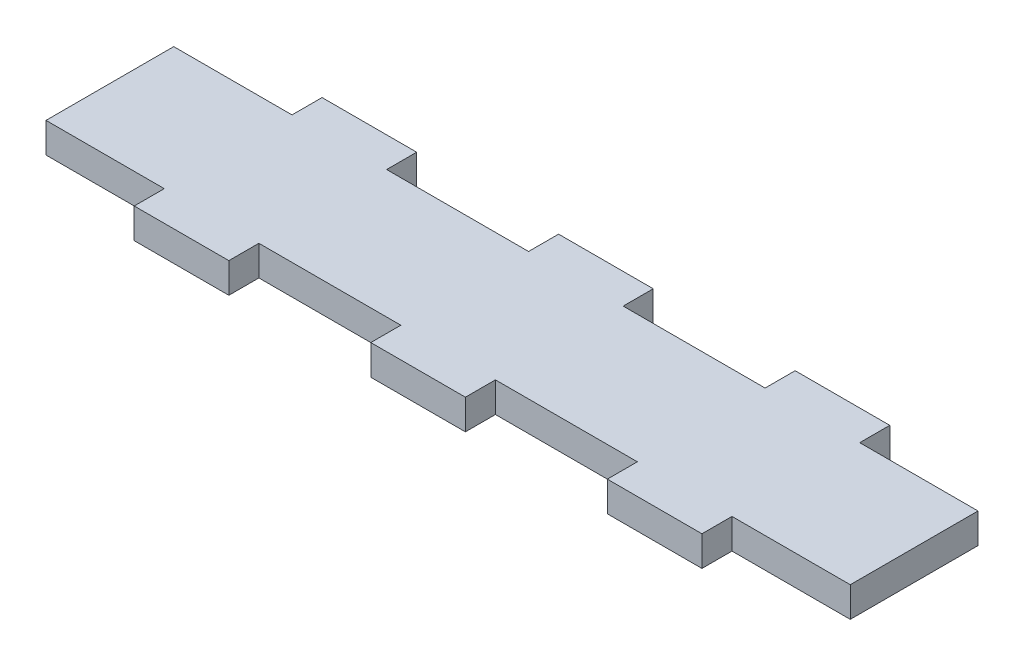
ISO-10303-21;
HEADER;
FILE_DESCRIPTION(('STEP AP214'),'2;1');
FILE_NAME('part.step','',(''),(''),'','','');
FILE_SCHEMA(('AUTOMOTIVE_DESIGN { 1 0 10303 214 1 1 1 1 }'));
ENDSEC;
DATA;
#1=APPLICATION_CONTEXT('core data for automotive mechanical design processes');
#2=APPLICATION_PROTOCOL_DEFINITION('international standard','automotive_design',2000,#1);
#3=PRODUCT_CONTEXT('',#1,'mechanical');
#4=PRODUCT('Part','Part','',(#3));
#5=PRODUCT_RELATED_PRODUCT_CATEGORY('part','',(#4));
#6=PRODUCT_DEFINITION_FORMATION('','',#4);
#7=PRODUCT_DEFINITION_CONTEXT('part definition',#1,'design');
#8=PRODUCT_DEFINITION('design','',#6,#7);
#9=PRODUCT_DEFINITION_SHAPE('','',#8);
#10=(LENGTH_UNIT() NAMED_UNIT(*) SI_UNIT(.MILLI.,.METRE.));
#11=(NAMED_UNIT(*) PLANE_ANGLE_UNIT() SI_UNIT($,.RADIAN.));
#12=(NAMED_UNIT(*) SI_UNIT($,.STERADIAN.) SOLID_ANGLE_UNIT());
#13=UNCERTAINTY_MEASURE_WITH_UNIT(LENGTH_MEASURE(1.E-05),#10,'distance_accuracy_value','');
#14=(GEOMETRIC_REPRESENTATION_CONTEXT(3) GLOBAL_UNCERTAINTY_ASSIGNED_CONTEXT((#13)) GLOBAL_UNIT_ASSIGNED_CONTEXT((#10,
#11,#12)) REPRESENTATION_CONTEXT('',''));
#15=CARTESIAN_POINT('',(0.,0.,0.));
#16=DIRECTION('',(0.,0.,1.));
#17=DIRECTION('',(1.,0.,0.));
#18=AXIS2_PLACEMENT_3D('',#15,#16,#17);
#19=CARTESIAN_POINT('',(60.,6.35,13.5));
#20=DIRECTION('',(0.,0.,-1.));
#21=DIRECTION('',(-1.,0.,0.));
#22=AXIS2_PLACEMENT_3D('',#19,#20,#21);
#23=PLANE('',#22);
#24=DIRECTION('',(1.,0.,0.));
#25=VECTOR('',#24,1.);
#26=CARTESIAN_POINT('',(60.,0.,13.5));
#27=LINE('',#26,#25);
#28=CARTESIAN_POINT('',(60.,0.,13.5));
#29=VERTEX_POINT('',#28);
#30=CARTESIAN_POINT('',(85.,0.,13.5));
#31=VERTEX_POINT('',#30);
#32=EDGE_CURVE('E249',#29,#31,#27,.T.);
#33=ORIENTED_EDGE('',*,*,#32,.T.);
#34=DIRECTION('',(0.,-1.,0.));
#35=VECTOR('',#34,1.);
#36=CARTESIAN_POINT('',(85.,6.35,13.5));
#37=LINE('',#36,#35);
#38=CARTESIAN_POINT('',(85.,6.35,13.5));
#39=VERTEX_POINT('',#38);
#40=EDGE_CURVE('E11',#39,#31,#37,.T.);
#41=ORIENTED_EDGE('',*,*,#40,.F.);
#42=DIRECTION('',(1.,0.,0.));
#43=VECTOR('',#42,1.);
#44=CARTESIAN_POINT('',(60.,6.35,13.5));
#45=LINE('',#44,#43);
#46=CARTESIAN_POINT('',(60.,6.35,13.5));
#47=VERTEX_POINT('',#46);
#48=EDGE_CURVE('E303',#47,#39,#45,.T.);
#49=ORIENTED_EDGE('',*,*,#48,.F.);
#50=DIRECTION('',(0.,-1.,0.));
#51=VECTOR('',#50,1.);
#52=CARTESIAN_POINT('',(60.,6.35,13.5));
#53=LINE('',#52,#51);
#54=EDGE_CURVE('E245',#47,#29,#53,.T.);
#55=ORIENTED_EDGE('',*,*,#54,.T.);
#56=EDGE_LOOP('',(#33,#41,#49,#55));
#57=FACE_BOUND('',#56,.T.);
#58=ADVANCED_FACE('F33',(#57),#23,.F.);
#59=CARTESIAN_POINT('',(85.,6.35,-13.5));
#60=DIRECTION('',(-1.,0.,0.));
#61=DIRECTION('',(0.,0.,1.));
#62=AXIS2_PLACEMENT_3D('',#59,#60,#61);
#63=PLANE('',#62);
#64=DIRECTION('',(0.,0.,-1.));
#65=VECTOR('',#64,1.);
#66=CARTESIAN_POINT('',(85.,0.,-13.5));
#67=LINE('',#66,#65);
#68=CARTESIAN_POINT('',(85.,0.,-13.5));
#69=VERTEX_POINT('',#68);
#70=EDGE_CURVE('E252',#31,#69,#67,.T.);
#71=ORIENTED_EDGE('',*,*,#70,.T.);
#72=DIRECTION('',(0.,-1.,0.));
#73=VECTOR('',#72,1.);
#74=CARTESIAN_POINT('',(85.,6.35,-13.5));
#75=LINE('',#74,#73);
#76=CARTESIAN_POINT('',(85.,6.35,-13.5));
#77=VERTEX_POINT('',#76);
#78=EDGE_CURVE('E41',#77,#69,#75,.T.);
#79=ORIENTED_EDGE('',*,*,#78,.F.);
#80=DIRECTION('',(0.,0.,-1.));
#81=VECTOR('',#80,1.);
#82=CARTESIAN_POINT('',(85.,6.35,-13.5));
#83=LINE('',#82,#81);
#84=EDGE_CURVE('E152',#39,#77,#83,.T.);
#85=ORIENTED_EDGE('',*,*,#84,.F.);
#86=ORIENTED_EDGE('',*,*,#40,.T.);
#87=EDGE_LOOP('',(#71,#79,#85,#86));
#88=FACE_BOUND('',#87,.T.);
#89=ADVANCED_FACE('F461',(#88),#63,.F.);
#90=CARTESIAN_POINT('',(60.,6.35,-13.5));
#91=DIRECTION('',(0.,0.,1.));
#92=DIRECTION('',(1.,0.,0.));
#93=AXIS2_PLACEMENT_3D('',#90,#91,#92);
#94=PLANE('',#93);
#95=DIRECTION('',(-1.,0.,0.));
#96=VECTOR('',#95,1.);
#97=CARTESIAN_POINT('',(60.,0.,-13.5));
#98=LINE('',#97,#96);
#99=CARTESIAN_POINT('',(60.,0.,-13.5));
#100=VERTEX_POINT('',#99);
#101=EDGE_CURVE('E254',#69,#100,#98,.T.);
#102=ORIENTED_EDGE('',*,*,#101,.T.);
#103=DIRECTION('',(0.,-1.,0.));
#104=VECTOR('',#103,1.);
#105=CARTESIAN_POINT('',(60.,6.35,-13.5));
#106=LINE('',#105,#104);
#107=CARTESIAN_POINT('',(60.,6.35,-13.5));
#108=VERTEX_POINT('',#107);
#109=EDGE_CURVE('E370',#108,#100,#106,.T.);
#110=ORIENTED_EDGE('',*,*,#109,.F.);
#111=DIRECTION('',(-1.,0.,0.));
#112=VECTOR('',#111,1.);
#113=CARTESIAN_POINT('',(60.,6.35,-13.5));
#114=LINE('',#113,#112);
#115=EDGE_CURVE('E378',#77,#108,#114,.T.);
#116=ORIENTED_EDGE('',*,*,#115,.F.);
#117=ORIENTED_EDGE('',*,*,#78,.T.);
#118=EDGE_LOOP('',(#102,#110,#116,#117));
#119=FACE_BOUND('',#118,.T.);
#120=ADVANCED_FACE('F376',(#119),#94,.F.);
#121=CARTESIAN_POINT('',(60.,6.35,-19.85));
#122=DIRECTION('',(-1.,0.,0.));
#123=DIRECTION('',(0.,0.,1.));
#124=AXIS2_PLACEMENT_3D('',#121,#122,#123);
#125=PLANE('',#124);
#126=DIRECTION('',(0.,0.,-1.));
#127=VECTOR('',#126,1.);
#128=CARTESIAN_POINT('',(60.,0.,-19.85));
#129=LINE('',#128,#127);
#130=CARTESIAN_POINT('',(60.,0.,-19.85));
#131=VERTEX_POINT('',#130);
#132=EDGE_CURVE('E256',#100,#131,#129,.T.);
#133=ORIENTED_EDGE('',*,*,#132,.T.);
#134=DIRECTION('',(0.,-1.,0.));
#135=VECTOR('',#134,1.);
#136=CARTESIAN_POINT('',(60.,6.35,-19.85));
#137=LINE('',#136,#135);
#138=CARTESIAN_POINT('',(60.,6.35,-19.85));
#139=VERTEX_POINT('',#138);
#140=EDGE_CURVE('E367',#139,#131,#137,.T.);
#141=ORIENTED_EDGE('',*,*,#140,.F.);
#142=DIRECTION('',(0.,0.,-1.));
#143=VECTOR('',#142,1.);
#144=CARTESIAN_POINT('',(60.,6.35,-19.85));
#145=LINE('',#144,#143);
#146=EDGE_CURVE('E396',#108,#139,#145,.T.);
#147=ORIENTED_EDGE('',*,*,#146,.F.);
#148=ORIENTED_EDGE('',*,*,#109,.T.);
#149=EDGE_LOOP('',(#133,#141,#147,#148));
#150=FACE_BOUND('',#149,.T.);
#151=ADVANCED_FACE('F387',(#150),#125,.F.);
#152=CARTESIAN_POINT('',(40.,6.35,-19.85));
#153=DIRECTION('',(0.,0.,1.));
#154=DIRECTION('',(1.,0.,0.));
#155=AXIS2_PLACEMENT_3D('',#152,#153,#154);
#156=PLANE('',#155);
#157=DIRECTION('',(-1.,0.,0.));
#158=VECTOR('',#157,1.);
#159=CARTESIAN_POINT('',(40.,0.,-19.85));
#160=LINE('',#159,#158);
#161=CARTESIAN_POINT('',(40.,0.,-19.85));
#162=VERTEX_POINT('',#161);
#163=EDGE_CURVE('E258',#131,#162,#160,.T.);
#164=ORIENTED_EDGE('',*,*,#163,.T.);
#165=DIRECTION('',(0.,-1.,0.));
#166=VECTOR('',#165,1.);
#167=CARTESIAN_POINT('',(40.,6.35,-19.85));
#168=LINE('',#167,#166);
#169=CARTESIAN_POINT('',(40.,6.35,-19.85));
#170=VERTEX_POINT('',#169);
#171=EDGE_CURVE('E364',#170,#162,#168,.T.);
#172=ORIENTED_EDGE('',*,*,#171,.F.);
#173=DIRECTION('',(-1.,0.,0.));
#174=VECTOR('',#173,1.);
#175=CARTESIAN_POINT('',(40.,6.35,-19.85));
#176=LINE('',#175,#174);
#177=EDGE_CURVE('E393',#139,#170,#176,.T.);
#178=ORIENTED_EDGE('',*,*,#177,.F.);
#179=ORIENTED_EDGE('',*,*,#140,.T.);
#180=EDGE_LOOP('',(#164,#172,#178,#179));
#181=FACE_BOUND('',#180,.T.);
#182=ADVANCED_FACE('F391',(#181),#156,.F.);
#183=CARTESIAN_POINT('',(40.,6.35,-13.5));
#184=DIRECTION('',(1.,0.,0.));
#185=DIRECTION('',(0.,0.,-1.));
#186=AXIS2_PLACEMENT_3D('',#183,#184,#185);
#187=PLANE('',#186);
#188=DIRECTION('',(0.,0.,1.));
#189=VECTOR('',#188,1.);
#190=CARTESIAN_POINT('',(40.,0.,-13.5));
#191=LINE('',#190,#189);
#192=CARTESIAN_POINT('',(40.,0.,-13.5));
#193=VERTEX_POINT('',#192);
#194=EDGE_CURVE('E260',#162,#193,#191,.T.);
#195=ORIENTED_EDGE('',*,*,#194,.T.);
#196=DIRECTION('',(0.,-1.,0.));
#197=VECTOR('',#196,1.);
#198=CARTESIAN_POINT('',(40.,6.35,-13.5));
#199=LINE('',#198,#197);
#200=CARTESIAN_POINT('',(40.,6.35,-13.5));
#201=VERTEX_POINT('',#200);
#202=EDGE_CURVE('E361',#201,#193,#199,.T.);
#203=ORIENTED_EDGE('',*,*,#202,.F.);
#204=DIRECTION('',(0.,0.,1.));
#205=VECTOR('',#204,1.);
#206=CARTESIAN_POINT('',(40.,6.35,-13.5));
#207=LINE('',#206,#205);
#208=EDGE_CURVE('E395',#170,#201,#207,.T.);
#209=ORIENTED_EDGE('',*,*,#208,.F.);
#210=ORIENTED_EDGE('',*,*,#171,.T.);
#211=EDGE_LOOP('',(#195,#203,#209,#210));
#212=FACE_BOUND('',#211,.T.);
#213=ADVANCED_FACE('F474',(#212),#187,.F.);
#214=CARTESIAN_POINT('',(10.,6.35,-13.5));
#215=DIRECTION('',(0.,0.,1.));
#216=DIRECTION('',(1.,0.,0.));
#217=AXIS2_PLACEMENT_3D('',#214,#215,#216);
#218=PLANE('',#217);
#219=DIRECTION('',(-1.,0.,0.));
#220=VECTOR('',#219,1.);
#221=CARTESIAN_POINT('',(10.,0.,-13.5));
#222=LINE('',#221,#220);
#223=CARTESIAN_POINT('',(10.,0.,-13.5));
#224=VERTEX_POINT('',#223);
#225=EDGE_CURVE('E262',#193,#224,#222,.T.);
#226=ORIENTED_EDGE('',*,*,#225,.T.);
#227=DIRECTION('',(0.,-1.,0.));
#228=VECTOR('',#227,1.);
#229=CARTESIAN_POINT('',(10.,6.35,-13.5));
#230=LINE('',#229,#228);
#231=CARTESIAN_POINT('',(10.,6.35,-13.5));
#232=VERTEX_POINT('',#231);
#233=EDGE_CURVE('E358',#232,#224,#230,.T.);
#234=ORIENTED_EDGE('',*,*,#233,.F.);
#235=DIRECTION('',(-1.,0.,0.));
#236=VECTOR('',#235,1.);
#237=CARTESIAN_POINT('',(10.,6.35,-13.5));
#238=LINE('',#237,#236);
#239=EDGE_CURVE('E398',#201,#232,#238,.T.);
#240=ORIENTED_EDGE('',*,*,#239,.F.);
#241=ORIENTED_EDGE('',*,*,#202,.T.);
#242=EDGE_LOOP('',(#226,#234,#240,#241));
#243=FACE_BOUND('',#242,.T.);
#244=ADVANCED_FACE('F477',(#243),#218,.F.);
#245=CARTESIAN_POINT('',(10.,6.35,-19.85));
#246=DIRECTION('',(-1.,0.,0.));
#247=DIRECTION('',(0.,0.,1.));
#248=AXIS2_PLACEMENT_3D('',#245,#246,#247);
#249=PLANE('',#248);
#250=DIRECTION('',(0.,0.,-1.));
#251=VECTOR('',#250,1.);
#252=CARTESIAN_POINT('',(10.,0.,-19.85));
#253=LINE('',#252,#251);
#254=CARTESIAN_POINT('',(10.,0.,-19.85));
#255=VERTEX_POINT('',#254);
#256=EDGE_CURVE('E264',#224,#255,#253,.T.);
#257=ORIENTED_EDGE('',*,*,#256,.T.);
#258=DIRECTION('',(0.,-1.,0.));
#259=VECTOR('',#258,1.);
#260=CARTESIAN_POINT('',(10.,6.35,-19.85));
#261=LINE('',#260,#259);
#262=CARTESIAN_POINT('',(10.,6.35,-19.85));
#263=VERTEX_POINT('',#262);
#264=EDGE_CURVE('E355',#263,#255,#261,.T.);
#265=ORIENTED_EDGE('',*,*,#264,.F.);
#266=DIRECTION('',(0.,0.,-1.));
#267=VECTOR('',#266,1.);
#268=CARTESIAN_POINT('',(10.,6.35,-19.85));
#269=LINE('',#268,#267);
#270=EDGE_CURVE('E404',#232,#263,#269,.T.);
#271=ORIENTED_EDGE('',*,*,#270,.F.);
#272=ORIENTED_EDGE('',*,*,#233,.T.);
#273=EDGE_LOOP('',(#257,#265,#271,#272));
#274=FACE_BOUND('',#273,.T.);
#275=ADVANCED_FACE('F481',(#274),#249,.F.);
#276=CARTESIAN_POINT('',(-9.99999999999999,6.35,-19.85));
#277=DIRECTION('',(0.,0.,1.));
#278=DIRECTION('',(1.,0.,0.));
#279=AXIS2_PLACEMENT_3D('',#276,#277,#278);
#280=PLANE('',#279);
#281=DIRECTION('',(-1.,0.,0.));
#282=VECTOR('',#281,1.);
#283=CARTESIAN_POINT('',(-9.99999999999999,0.,-19.85));
#284=LINE('',#283,#282);
#285=CARTESIAN_POINT('',(-9.99999999999999,0.,-19.85));
#286=VERTEX_POINT('',#285);
#287=EDGE_CURVE('E266',#255,#286,#284,.T.);
#288=ORIENTED_EDGE('',*,*,#287,.T.);
#289=DIRECTION('',(0.,-1.,0.));
#290=VECTOR('',#289,1.);
#291=CARTESIAN_POINT('',(-9.99999999999999,6.35,-19.85));
#292=LINE('',#291,#290);
#293=CARTESIAN_POINT('',(-9.99999999999999,6.35,-19.85));
#294=VERTEX_POINT('',#293);
#295=EDGE_CURVE('E352',#294,#286,#292,.T.);
#296=ORIENTED_EDGE('',*,*,#295,.F.);
#297=DIRECTION('',(-1.,0.,0.));
#298=VECTOR('',#297,1.);
#299=CARTESIAN_POINT('',(-9.99999999999999,6.35,-19.85));
#300=LINE('',#299,#298);
#301=EDGE_CURVE('E406',#263,#294,#300,.T.);
#302=ORIENTED_EDGE('',*,*,#301,.F.);
#303=ORIENTED_EDGE('',*,*,#264,.T.);
#304=EDGE_LOOP('',(#288,#296,#302,#303));
#305=FACE_BOUND('',#304,.T.);
#306=ADVANCED_FACE('F485',(#305),#280,.F.);
#307=CARTESIAN_POINT('',(-10.,6.35,-13.5));
#308=DIRECTION('',(1.,0.,0.));
#309=DIRECTION('',(0.,0.,-1.));
#310=AXIS2_PLACEMENT_3D('',#307,#308,#309);
#311=PLANE('',#310);
#312=DIRECTION('',(0.,0.,1.));
#313=VECTOR('',#312,1.);
#314=CARTESIAN_POINT('',(-10.,0.,-13.5));
#315=LINE('',#314,#313);
#316=CARTESIAN_POINT('',(-10.,0.,-13.5));
#317=VERTEX_POINT('',#316);
#318=EDGE_CURVE('E268',#286,#317,#315,.T.);
#319=ORIENTED_EDGE('',*,*,#318,.T.);
#320=DIRECTION('',(0.,-1.,0.));
#321=VECTOR('',#320,1.);
#322=CARTESIAN_POINT('',(-10.,6.35,-13.5));
#323=LINE('',#322,#321);
#324=CARTESIAN_POINT('',(-10.,6.35,-13.5));
#325=VERTEX_POINT('',#324);
#326=EDGE_CURVE('E349',#325,#317,#323,.T.);
#327=ORIENTED_EDGE('',*,*,#326,.F.);
#328=DIRECTION('',(0.,0.,1.));
#329=VECTOR('',#328,1.);
#330=CARTESIAN_POINT('',(-10.,6.35,-13.5));
#331=LINE('',#330,#329);
#332=EDGE_CURVE('E408',#294,#325,#331,.T.);
#333=ORIENTED_EDGE('',*,*,#332,.F.);
#334=ORIENTED_EDGE('',*,*,#295,.T.);
#335=EDGE_LOOP('',(#319,#327,#333,#334));
#336=FACE_BOUND('',#335,.T.);
#337=ADVANCED_FACE('F489',(#336),#311,.F.);
#338=CARTESIAN_POINT('',(-40.,6.35,-13.5));
#339=DIRECTION('',(0.,0.,1.));
#340=DIRECTION('',(1.,0.,0.));
#341=AXIS2_PLACEMENT_3D('',#338,#339,#340);
#342=PLANE('',#341);
#343=DIRECTION('',(-1.,0.,0.));
#344=VECTOR('',#343,1.);
#345=CARTESIAN_POINT('',(-40.,0.,-13.5));
#346=LINE('',#345,#344);
#347=CARTESIAN_POINT('',(-40.,0.,-13.5));
#348=VERTEX_POINT('',#347);
#349=EDGE_CURVE('E270',#317,#348,#346,.T.);
#350=ORIENTED_EDGE('',*,*,#349,.T.);
#351=DIRECTION('',(0.,-1.,0.));
#352=VECTOR('',#351,1.);
#353=CARTESIAN_POINT('',(-40.,6.35,-13.5));
#354=LINE('',#353,#352);
#355=CARTESIAN_POINT('',(-40.,6.35,-13.5));
#356=VERTEX_POINT('',#355);
#357=EDGE_CURVE('E346',#356,#348,#354,.T.);
#358=ORIENTED_EDGE('',*,*,#357,.F.);
#359=DIRECTION('',(-1.,0.,0.));
#360=VECTOR('',#359,1.);
#361=CARTESIAN_POINT('',(-40.,6.35,-13.5));
#362=LINE('',#361,#360);
#363=EDGE_CURVE('E410',#325,#356,#362,.T.);
#364=ORIENTED_EDGE('',*,*,#363,.F.);
#365=ORIENTED_EDGE('',*,*,#326,.T.);
#366=EDGE_LOOP('',(#350,#358,#364,#365));
#367=FACE_BOUND('',#366,.T.);
#368=ADVANCED_FACE('F493',(#367),#342,.F.);
#369=CARTESIAN_POINT('',(-40.,6.35,-19.85));
#370=DIRECTION('',(-1.,0.,0.));
#371=DIRECTION('',(0.,0.,1.));
#372=AXIS2_PLACEMENT_3D('',#369,#370,#371);
#373=PLANE('',#372);
#374=DIRECTION('',(0.,0.,-1.));
#375=VECTOR('',#374,1.);
#376=CARTESIAN_POINT('',(-40.,0.,-19.85));
#377=LINE('',#376,#375);
#378=CARTESIAN_POINT('',(-40.,0.,-19.85));
#379=VERTEX_POINT('',#378);
#380=EDGE_CURVE('E272',#348,#379,#377,.T.);
#381=ORIENTED_EDGE('',*,*,#380,.T.);
#382=DIRECTION('',(0.,-1.,0.));
#383=VECTOR('',#382,1.);
#384=CARTESIAN_POINT('',(-40.,6.35,-19.85));
#385=LINE('',#384,#383);
#386=CARTESIAN_POINT('',(-40.,6.35,-19.85));
#387=VERTEX_POINT('',#386);
#388=EDGE_CURVE('E343',#387,#379,#385,.T.);
#389=ORIENTED_EDGE('',*,*,#388,.F.);
#390=DIRECTION('',(0.,0.,-1.));
#391=VECTOR('',#390,1.);
#392=CARTESIAN_POINT('',(-40.,6.35,-19.85));
#393=LINE('',#392,#391);
#394=EDGE_CURVE('E412',#356,#387,#393,.T.);
#395=ORIENTED_EDGE('',*,*,#394,.F.);
#396=ORIENTED_EDGE('',*,*,#357,.T.);
#397=EDGE_LOOP('',(#381,#389,#395,#396));
#398=FACE_BOUND('',#397,.T.);
#399=ADVANCED_FACE('F497',(#398),#373,.F.);
#400=CARTESIAN_POINT('',(-60.,6.35,-19.85));
#401=DIRECTION('',(0.,0.,1.));
#402=DIRECTION('',(1.,0.,0.));
#403=AXIS2_PLACEMENT_3D('',#400,#401,#402);
#404=PLANE('',#403);
#405=DIRECTION('',(-1.,0.,0.));
#406=VECTOR('',#405,1.);
#407=CARTESIAN_POINT('',(-60.,0.,-19.85));
#408=LINE('',#407,#406);
#409=CARTESIAN_POINT('',(-60.,0.,-19.85));
#410=VERTEX_POINT('',#409);
#411=EDGE_CURVE('E274',#379,#410,#408,.T.);
#412=ORIENTED_EDGE('',*,*,#411,.T.);
#413=DIRECTION('',(0.,-1.,0.));
#414=VECTOR('',#413,1.);
#415=CARTESIAN_POINT('',(-60.,6.35,-19.85));
#416=LINE('',#415,#414);
#417=CARTESIAN_POINT('',(-60.,6.35,-19.85));
#418=VERTEX_POINT('',#417);
#419=EDGE_CURVE('E340',#418,#410,#416,.T.);
#420=ORIENTED_EDGE('',*,*,#419,.F.);
#421=DIRECTION('',(-1.,0.,0.));
#422=VECTOR('',#421,1.);
#423=CARTESIAN_POINT('',(-60.,6.35,-19.85));
#424=LINE('',#423,#422);
#425=EDGE_CURVE('E414',#387,#418,#424,.T.);
#426=ORIENTED_EDGE('',*,*,#425,.F.);
#427=ORIENTED_EDGE('',*,*,#388,.T.);
#428=EDGE_LOOP('',(#412,#420,#426,#427));
#429=FACE_BOUND('',#428,.T.);
#430=ADVANCED_FACE('F501',(#429),#404,.F.);
#431=CARTESIAN_POINT('',(-60.,6.35,-13.5));
#432=DIRECTION('',(1.,0.,0.));
#433=DIRECTION('',(0.,0.,-1.));
#434=AXIS2_PLACEMENT_3D('',#431,#432,#433);
#435=PLANE('',#434);
#436=DIRECTION('',(0.,0.,1.));
#437=VECTOR('',#436,1.);
#438=CARTESIAN_POINT('',(-60.,0.,-13.5));
#439=LINE('',#438,#437);
#440=CARTESIAN_POINT('',(-60.,0.,-13.5));
#441=VERTEX_POINT('',#440);
#442=EDGE_CURVE('E276',#410,#441,#439,.T.);
#443=ORIENTED_EDGE('',*,*,#442,.T.);
#444=DIRECTION('',(0.,-1.,0.));
#445=VECTOR('',#444,1.);
#446=CARTESIAN_POINT('',(-60.,6.35,-13.5));
#447=LINE('',#446,#445);
#448=CARTESIAN_POINT('',(-60.,6.35,-13.5));
#449=VERTEX_POINT('',#448);
#450=EDGE_CURVE('E337',#449,#441,#447,.T.);
#451=ORIENTED_EDGE('',*,*,#450,.F.);
#452=DIRECTION('',(0.,0.,1.));
#453=VECTOR('',#452,1.);
#454=CARTESIAN_POINT('',(-60.,6.35,-13.5));
#455=LINE('',#454,#453);
#456=EDGE_CURVE('E416',#418,#449,#455,.T.);
#457=ORIENTED_EDGE('',*,*,#456,.F.);
#458=ORIENTED_EDGE('',*,*,#419,.T.);
#459=EDGE_LOOP('',(#443,#451,#457,#458));
#460=FACE_BOUND('',#459,.T.);
#461=ADVANCED_FACE('F505',(#460),#435,.F.);
#462=CARTESIAN_POINT('',(-85.,6.35,-13.5));
#463=DIRECTION('',(0.,0.,1.));
#464=DIRECTION('',(1.,0.,0.));
#465=AXIS2_PLACEMENT_3D('',#462,#463,#464);
#466=PLANE('',#465);
#467=DIRECTION('',(-1.,0.,0.));
#468=VECTOR('',#467,1.);
#469=CARTESIAN_POINT('',(-85.,0.,-13.5));
#470=LINE('',#469,#468);
#471=CARTESIAN_POINT('',(-85.,0.,-13.5));
#472=VERTEX_POINT('',#471);
#473=EDGE_CURVE('E278',#441,#472,#470,.T.);
#474=ORIENTED_EDGE('',*,*,#473,.T.);
#475=DIRECTION('',(0.,-1.,0.));
#476=VECTOR('',#475,1.);
#477=CARTESIAN_POINT('',(-85.,6.35,-13.5));
#478=LINE('',#477,#476);
#479=CARTESIAN_POINT('',(-85.,6.35,-13.5));
#480=VERTEX_POINT('',#479);
#481=EDGE_CURVE('E334',#480,#472,#478,.T.);
#482=ORIENTED_EDGE('',*,*,#481,.F.);
#483=DIRECTION('',(-1.,0.,0.));
#484=VECTOR('',#483,1.);
#485=CARTESIAN_POINT('',(-85.,6.35,-13.5));
#486=LINE('',#485,#484);
#487=EDGE_CURVE('E418',#449,#480,#486,.T.);
#488=ORIENTED_EDGE('',*,*,#487,.F.);
#489=ORIENTED_EDGE('',*,*,#450,.T.);
#490=EDGE_LOOP('',(#474,#482,#488,#489));
#491=FACE_BOUND('',#490,.T.);
#492=ADVANCED_FACE('F509',(#491),#466,.F.);
#493=CARTESIAN_POINT('',(-85.,6.35,-13.5));
#494=DIRECTION('',(1.,0.,0.));
#495=DIRECTION('',(0.,0.,-1.));
#496=AXIS2_PLACEMENT_3D('',#493,#494,#495);
#497=PLANE('',#496);
#498=DIRECTION('',(0.,0.,1.));
#499=VECTOR('',#498,1.);
#500=CARTESIAN_POINT('',(-85.,0.,-13.5));
#501=LINE('',#500,#499);
#502=CARTESIAN_POINT('',(-85.,0.,13.5));
#503=VERTEX_POINT('',#502);
#504=EDGE_CURVE('E280',#472,#503,#501,.T.);
#505=ORIENTED_EDGE('',*,*,#504,.T.);
#506=DIRECTION('',(0.,-1.,0.));
#507=VECTOR('',#506,1.);
#508=CARTESIAN_POINT('',(-85.,6.35,13.5));
#509=LINE('',#508,#507);
#510=CARTESIAN_POINT('',(-85.,6.35,13.5));
#511=VERTEX_POINT('',#510);
#512=EDGE_CURVE('E331',#511,#503,#509,.T.);
#513=ORIENTED_EDGE('',*,*,#512,.F.);
#514=DIRECTION('',(0.,0.,1.));
#515=VECTOR('',#514,1.);
#516=CARTESIAN_POINT('',(-85.,6.35,-13.5));
#517=LINE('',#516,#515);
#518=EDGE_CURVE('E420',#480,#511,#517,.T.);
#519=ORIENTED_EDGE('',*,*,#518,.F.);
#520=ORIENTED_EDGE('',*,*,#481,.T.);
#521=EDGE_LOOP('',(#505,#513,#519,#520));
#522=FACE_BOUND('',#521,.T.);
#523=ADVANCED_FACE('F513',(#522),#497,.F.);
#524=CARTESIAN_POINT('',(-85.,6.35,13.5));
#525=DIRECTION('',(0.,0.,-1.));
#526=DIRECTION('',(-1.,0.,0.));
#527=AXIS2_PLACEMENT_3D('',#524,#525,#526);
#528=PLANE('',#527);
#529=DIRECTION('',(1.,0.,0.));
#530=VECTOR('',#529,1.);
#531=CARTESIAN_POINT('',(-85.,0.,13.5));
#532=LINE('',#531,#530);
#533=CARTESIAN_POINT('',(-60.,0.,13.5));
#534=VERTEX_POINT('',#533);
#535=EDGE_CURVE('E282',#503,#534,#532,.T.);
#536=ORIENTED_EDGE('',*,*,#535,.T.);
#537=DIRECTION('',(0.,-1.,0.));
#538=VECTOR('',#537,1.);
#539=CARTESIAN_POINT('',(-60.,6.35,13.5));
#540=LINE('',#539,#538);
#541=CARTESIAN_POINT('',(-60.,6.35,13.5));
#542=VERTEX_POINT('',#541);
#543=EDGE_CURVE('E328',#542,#534,#540,.T.);
#544=ORIENTED_EDGE('',*,*,#543,.F.);
#545=DIRECTION('',(1.,0.,0.));
#546=VECTOR('',#545,1.);
#547=CARTESIAN_POINT('',(-85.,6.35,13.5));
#548=LINE('',#547,#546);
#549=EDGE_CURVE('E422',#511,#542,#548,.T.);
#550=ORIENTED_EDGE('',*,*,#549,.F.);
#551=ORIENTED_EDGE('',*,*,#512,.T.);
#552=EDGE_LOOP('',(#536,#544,#550,#551));
#553=FACE_BOUND('',#552,.T.);
#554=ADVANCED_FACE('F517',(#553),#528,.F.);
#555=CARTESIAN_POINT('',(-60.,6.35,13.5));
#556=DIRECTION('',(1.,0.,0.));
#557=DIRECTION('',(0.,0.,-1.));
#558=AXIS2_PLACEMENT_3D('',#555,#556,#557);
#559=PLANE('',#558);
#560=DIRECTION('',(0.,0.,1.));
#561=VECTOR('',#560,1.);
#562=CARTESIAN_POINT('',(-60.,0.,13.5));
#563=LINE('',#562,#561);
#564=CARTESIAN_POINT('',(-60.,0.,19.85));
#565=VERTEX_POINT('',#564);
#566=EDGE_CURVE('E284',#534,#565,#563,.T.);
#567=ORIENTED_EDGE('',*,*,#566,.T.);
#568=DIRECTION('',(0.,-1.,0.));
#569=VECTOR('',#568,1.);
#570=CARTESIAN_POINT('',(-60.,6.35,19.85));
#571=LINE('',#570,#569);
#572=CARTESIAN_POINT('',(-60.,6.35,19.85));
#573=VERTEX_POINT('',#572);
#574=EDGE_CURVE('E325',#573,#565,#571,.T.);
#575=ORIENTED_EDGE('',*,*,#574,.F.);
#576=DIRECTION('',(0.,0.,1.));
#577=VECTOR('',#576,1.);
#578=CARTESIAN_POINT('',(-60.,6.35,13.5));
#579=LINE('',#578,#577);
#580=EDGE_CURVE('E424',#542,#573,#579,.T.);
#581=ORIENTED_EDGE('',*,*,#580,.F.);
#582=ORIENTED_EDGE('',*,*,#543,.T.);
#583=EDGE_LOOP('',(#567,#575,#581,#582));
#584=FACE_BOUND('',#583,.T.);
#585=ADVANCED_FACE('F521',(#584),#559,.F.);
#586=CARTESIAN_POINT('',(-60.,6.35,19.85));
#587=DIRECTION('',(0.,0.,-1.));
#588=DIRECTION('',(-1.,0.,0.));
#589=AXIS2_PLACEMENT_3D('',#586,#587,#588);
#590=PLANE('',#589);
#591=DIRECTION('',(1.,0.,0.));
#592=VECTOR('',#591,1.);
#593=CARTESIAN_POINT('',(-60.,0.,19.85));
#594=LINE('',#593,#592);
#595=CARTESIAN_POINT('',(-40.,0.,19.85));
#596=VERTEX_POINT('',#595);
#597=EDGE_CURVE('E286',#565,#596,#594,.T.);
#598=ORIENTED_EDGE('',*,*,#597,.T.);
#599=DIRECTION('',(0.,-1.,0.));
#600=VECTOR('',#599,1.);
#601=CARTESIAN_POINT('',(-40.,6.35,19.85));
#602=LINE('',#601,#600);
#603=CARTESIAN_POINT('',(-40.,6.35,19.85));
#604=VERTEX_POINT('',#603);
#605=EDGE_CURVE('E322',#604,#596,#602,.T.);
#606=ORIENTED_EDGE('',*,*,#605,.F.);
#607=DIRECTION('',(1.,0.,0.));
#608=VECTOR('',#607,1.);
#609=CARTESIAN_POINT('',(-60.,6.35,19.85));
#610=LINE('',#609,#608);
#611=EDGE_CURVE('E426',#573,#604,#610,.T.);
#612=ORIENTED_EDGE('',*,*,#611,.F.);
#613=ORIENTED_EDGE('',*,*,#574,.T.);
#614=EDGE_LOOP('',(#598,#606,#612,#613));
#615=FACE_BOUND('',#614,.T.);
#616=ADVANCED_FACE('F525',(#615),#590,.F.);
#617=CARTESIAN_POINT('',(-40.,6.35,19.85));
#618=DIRECTION('',(-1.,0.,0.));
#619=DIRECTION('',(0.,0.,1.));
#620=AXIS2_PLACEMENT_3D('',#617,#618,#619);
#621=PLANE('',#620);
#622=DIRECTION('',(0.,0.,-1.));
#623=VECTOR('',#622,1.);
#624=CARTESIAN_POINT('',(-40.,0.,19.85));
#625=LINE('',#624,#623);
#626=CARTESIAN_POINT('',(-40.,0.,13.5));
#627=VERTEX_POINT('',#626);
#628=EDGE_CURVE('E288',#596,#627,#625,.T.);
#629=ORIENTED_EDGE('',*,*,#628,.T.);
#630=DIRECTION('',(0.,-1.,0.));
#631=VECTOR('',#630,1.);
#632=CARTESIAN_POINT('',(-40.,6.35,13.5));
#633=LINE('',#632,#631);
#634=CARTESIAN_POINT('',(-40.,6.35,13.5));
#635=VERTEX_POINT('',#634);
#636=EDGE_CURVE('E319',#635,#627,#633,.T.);
#637=ORIENTED_EDGE('',*,*,#636,.F.);
#638=DIRECTION('',(0.,0.,-1.));
#639=VECTOR('',#638,1.);
#640=CARTESIAN_POINT('',(-40.,6.35,19.85));
#641=LINE('',#640,#639);
#642=EDGE_CURVE('E428',#604,#635,#641,.T.);
#643=ORIENTED_EDGE('',*,*,#642,.F.);
#644=ORIENTED_EDGE('',*,*,#605,.T.);
#645=EDGE_LOOP('',(#629,#637,#643,#644));
#646=FACE_BOUND('',#645,.T.);
#647=ADVANCED_FACE('F529',(#646),#621,.F.);
#648=CARTESIAN_POINT('',(-40.,6.35,13.5));
#649=DIRECTION('',(0.,0.,-1.));
#650=DIRECTION('',(-1.,0.,0.));
#651=AXIS2_PLACEMENT_3D('',#648,#649,#650);
#652=PLANE('',#651);
#653=DIRECTION('',(1.,0.,0.));
#654=VECTOR('',#653,1.);
#655=CARTESIAN_POINT('',(-40.,0.,13.5));
#656=LINE('',#655,#654);
#657=CARTESIAN_POINT('',(-10.,0.,13.5));
#658=VERTEX_POINT('',#657);
#659=EDGE_CURVE('E290',#627,#658,#656,.T.);
#660=ORIENTED_EDGE('',*,*,#659,.T.);
#661=DIRECTION('',(0.,-1.,0.));
#662=VECTOR('',#661,1.);
#663=CARTESIAN_POINT('',(-10.,6.35,13.5));
#664=LINE('',#663,#662);
#665=CARTESIAN_POINT('',(-10.,6.35,13.5));
#666=VERTEX_POINT('',#665);
#667=EDGE_CURVE('E316',#666,#658,#664,.T.);
#668=ORIENTED_EDGE('',*,*,#667,.F.);
#669=DIRECTION('',(1.,0.,0.));
#670=VECTOR('',#669,1.);
#671=CARTESIAN_POINT('',(-40.,6.35,13.5));
#672=LINE('',#671,#670);
#673=EDGE_CURVE('E430',#635,#666,#672,.T.);
#674=ORIENTED_EDGE('',*,*,#673,.F.);
#675=ORIENTED_EDGE('',*,*,#636,.T.);
#676=EDGE_LOOP('',(#660,#668,#674,#675));
#677=FACE_BOUND('',#676,.T.);
#678=ADVANCED_FACE('F533',(#677),#652,.F.);
#679=CARTESIAN_POINT('',(-10.,6.35,13.5));
#680=DIRECTION('',(1.,0.,0.));
#681=DIRECTION('',(0.,0.,-1.));
#682=AXIS2_PLACEMENT_3D('',#679,#680,#681);
#683=PLANE('',#682);
#684=DIRECTION('',(0.,0.,1.));
#685=VECTOR('',#684,1.);
#686=CARTESIAN_POINT('',(-10.,0.,13.5));
#687=LINE('',#686,#685);
#688=CARTESIAN_POINT('',(-10.,0.,19.85));
#689=VERTEX_POINT('',#688);
#690=EDGE_CURVE('E292',#658,#689,#687,.T.);
#691=ORIENTED_EDGE('',*,*,#690,.T.);
#692=DIRECTION('',(0.,-1.,0.));
#693=VECTOR('',#692,1.);
#694=CARTESIAN_POINT('',(-10.,6.35,19.85));
#695=LINE('',#694,#693);
#696=CARTESIAN_POINT('',(-10.,6.35,19.85));
#697=VERTEX_POINT('',#696);
#698=EDGE_CURVE('E313',#697,#689,#695,.T.);
#699=ORIENTED_EDGE('',*,*,#698,.F.);
#700=DIRECTION('',(0.,0.,1.));
#701=VECTOR('',#700,1.);
#702=CARTESIAN_POINT('',(-10.,6.35,13.5));
#703=LINE('',#702,#701);
#704=EDGE_CURVE('E432',#666,#697,#703,.T.);
#705=ORIENTED_EDGE('',*,*,#704,.F.);
#706=ORIENTED_EDGE('',*,*,#667,.T.);
#707=EDGE_LOOP('',(#691,#699,#705,#706));
#708=FACE_BOUND('',#707,.T.);
#709=ADVANCED_FACE('F537',(#708),#683,.F.);
#710=CARTESIAN_POINT('',(-10.,6.35,19.85));
#711=DIRECTION('',(0.,0.,-1.));
#712=DIRECTION('',(-1.,0.,0.));
#713=AXIS2_PLACEMENT_3D('',#710,#711,#712);
#714=PLANE('',#713);
#715=DIRECTION('',(1.,0.,0.));
#716=VECTOR('',#715,1.);
#717=CARTESIAN_POINT('',(-10.,0.,19.85));
#718=LINE('',#717,#716);
#719=CARTESIAN_POINT('',(10.,0.,19.85));
#720=VERTEX_POINT('',#719);
#721=EDGE_CURVE('E294',#689,#720,#718,.T.);
#722=ORIENTED_EDGE('',*,*,#721,.T.);
#723=DIRECTION('',(0.,-1.,0.));
#724=VECTOR('',#723,1.);
#725=CARTESIAN_POINT('',(10.,6.35,19.85));
#726=LINE('',#725,#724);
#727=CARTESIAN_POINT('',(10.,6.35,19.85));
#728=VERTEX_POINT('',#727);
#729=EDGE_CURVE('E310',#728,#720,#726,.T.);
#730=ORIENTED_EDGE('',*,*,#729,.F.);
#731=DIRECTION('',(1.,0.,0.));
#732=VECTOR('',#731,1.);
#733=CARTESIAN_POINT('',(-10.,6.35,19.85));
#734=LINE('',#733,#732);
#735=EDGE_CURVE('E434',#697,#728,#734,.T.);
#736=ORIENTED_EDGE('',*,*,#735,.F.);
#737=ORIENTED_EDGE('',*,*,#698,.T.);
#738=EDGE_LOOP('',(#722,#730,#736,#737));
#739=FACE_BOUND('',#738,.T.);
#740=ADVANCED_FACE('F541',(#739),#714,.F.);
#741=CARTESIAN_POINT('',(10.,6.35,19.85));
#742=DIRECTION('',(-1.,0.,0.));
#743=DIRECTION('',(0.,0.,1.));
#744=AXIS2_PLACEMENT_3D('',#741,#742,#743);
#745=PLANE('',#744);
#746=DIRECTION('',(0.,0.,-1.));
#747=VECTOR('',#746,1.);
#748=CARTESIAN_POINT('',(10.,0.,19.85));
#749=LINE('',#748,#747);
#750=CARTESIAN_POINT('',(10.,0.,13.5));
#751=VERTEX_POINT('',#750);
#752=EDGE_CURVE('E296',#720,#751,#749,.T.);
#753=ORIENTED_EDGE('',*,*,#752,.T.);
#754=DIRECTION('',(0.,-1.,0.));
#755=VECTOR('',#754,1.);
#756=CARTESIAN_POINT('',(10.,6.35,13.5));
#757=LINE('',#756,#755);
#758=CARTESIAN_POINT('',(10.,6.35,13.5));
#759=VERTEX_POINT('',#758);
#760=EDGE_CURVE('E307',#759,#751,#757,.T.);
#761=ORIENTED_EDGE('',*,*,#760,.F.);
#762=DIRECTION('',(0.,0.,-1.));
#763=VECTOR('',#762,1.);
#764=CARTESIAN_POINT('',(10.,6.35,19.85));
#765=LINE('',#764,#763);
#766=EDGE_CURVE('E436',#728,#759,#765,.T.);
#767=ORIENTED_EDGE('',*,*,#766,.F.);
#768=ORIENTED_EDGE('',*,*,#729,.T.);
#769=EDGE_LOOP('',(#753,#761,#767,#768));
#770=FACE_BOUND('',#769,.T.);
#771=ADVANCED_FACE('F442',(#770),#745,.F.);
#772=CARTESIAN_POINT('',(10.,6.35,13.5));
#773=DIRECTION('',(0.,0.,-1.));
#774=DIRECTION('',(-1.,0.,0.));
#775=AXIS2_PLACEMENT_3D('',#772,#773,#774);
#776=PLANE('',#775);
#777=DIRECTION('',(1.,0.,0.));
#778=VECTOR('',#777,1.);
#779=CARTESIAN_POINT('',(10.,0.,13.5));
#780=LINE('',#779,#778);
#781=CARTESIAN_POINT('',(40.,0.,13.5));
#782=VERTEX_POINT('',#781);
#783=EDGE_CURVE('E298',#751,#782,#780,.T.);
#784=ORIENTED_EDGE('',*,*,#783,.T.);
#785=DIRECTION('',(0.,-1.,0.));
#786=VECTOR('',#785,1.);
#787=CARTESIAN_POINT('',(40.,6.35,13.5));
#788=LINE('',#787,#786);
#789=CARTESIAN_POINT('',(40.,6.35,13.5));
#790=VERTEX_POINT('',#789);
#791=EDGE_CURVE('E240',#790,#782,#788,.T.);
#792=ORIENTED_EDGE('',*,*,#791,.F.);
#793=DIRECTION('',(1.,0.,0.));
#794=VECTOR('',#793,1.);
#795=CARTESIAN_POINT('',(10.,6.35,13.5));
#796=LINE('',#795,#794);
#797=EDGE_CURVE('E231',#759,#790,#796,.T.);
#798=ORIENTED_EDGE('',*,*,#797,.F.);
#799=ORIENTED_EDGE('',*,*,#760,.T.);
#800=EDGE_LOOP('',(#784,#792,#798,#799));
#801=FACE_BOUND('',#800,.T.);
#802=ADVANCED_FACE('F446',(#801),#776,.F.);
#803=CARTESIAN_POINT('',(40.,6.35,13.5));
#804=DIRECTION('',(1.,0.,0.));
#805=DIRECTION('',(0.,0.,-1.));
#806=AXIS2_PLACEMENT_3D('',#803,#804,#805);
#807=PLANE('',#806);
#808=DIRECTION('',(0.,0.,1.));
#809=VECTOR('',#808,1.);
#810=CARTESIAN_POINT('',(40.,0.,13.5));
#811=LINE('',#810,#809);
#812=CARTESIAN_POINT('',(40.,0.,19.85));
#813=VERTEX_POINT('',#812);
#814=EDGE_CURVE('E239',#782,#813,#811,.T.);
#815=ORIENTED_EDGE('',*,*,#814,.T.);
#816=DIRECTION('',(0.,-1.,0.));
#817=VECTOR('',#816,1.);
#818=CARTESIAN_POINT('',(40.,6.35,19.85));
#819=LINE('',#818,#817);
#820=CARTESIAN_POINT('',(40.,6.35,19.85));
#821=VERTEX_POINT('',#820);
#822=EDGE_CURVE('E236',#821,#813,#819,.T.);
#823=ORIENTED_EDGE('',*,*,#822,.F.);
#824=DIRECTION('',(0.,0.,1.));
#825=VECTOR('',#824,1.);
#826=CARTESIAN_POINT('',(40.,6.35,13.5));
#827=LINE('',#826,#825);
#828=EDGE_CURVE('E225',#790,#821,#827,.T.);
#829=ORIENTED_EDGE('',*,*,#828,.F.);
#830=ORIENTED_EDGE('',*,*,#791,.T.);
#831=EDGE_LOOP('',(#815,#823,#829,#830));
#832=FACE_BOUND('',#831,.T.);
#833=ADVANCED_FACE('F237',(#832),#807,.F.);
#834=CARTESIAN_POINT('',(40.,6.35,19.85));
#835=DIRECTION('',(0.,0.,-1.));
#836=DIRECTION('',(-1.,0.,0.));
#837=AXIS2_PLACEMENT_3D('',#834,#835,#836);
#838=PLANE('',#837);
#839=DIRECTION('',(1.,0.,0.));
#840=VECTOR('',#839,1.);
#841=CARTESIAN_POINT('',(40.,0.,19.85));
#842=LINE('',#841,#840);
#843=CARTESIAN_POINT('',(60.,0.,19.85));
#844=VERTEX_POINT('',#843);
#845=EDGE_CURVE('E138',#813,#844,#842,.T.);
#846=ORIENTED_EDGE('',*,*,#845,.T.);
#847=DIRECTION('',(0.,-1.,0.));
#848=VECTOR('',#847,1.);
#849=CARTESIAN_POINT('',(60.,6.35,19.85));
#850=LINE('',#849,#848);
#851=CARTESIAN_POINT('',(60.,6.35,19.85));
#852=VERTEX_POINT('',#851);
#853=EDGE_CURVE('E241',#852,#844,#850,.T.);
#854=ORIENTED_EDGE('',*,*,#853,.F.);
#855=DIRECTION('',(1.,0.,0.));
#856=VECTOR('',#855,1.);
#857=CARTESIAN_POINT('',(40.,6.35,19.85));
#858=LINE('',#857,#856);
#859=EDGE_CURVE('E229',#821,#852,#858,.T.);
#860=ORIENTED_EDGE('',*,*,#859,.F.);
#861=ORIENTED_EDGE('',*,*,#822,.T.);
#862=EDGE_LOOP('',(#846,#854,#860,#861));
#863=FACE_BOUND('',#862,.T.);
#864=ADVANCED_FACE('F243',(#863),#838,.F.);
#865=CARTESIAN_POINT('',(60.,6.35,19.85));
#866=DIRECTION('',(-1.,0.,0.));
#867=DIRECTION('',(0.,0.,1.));
#868=AXIS2_PLACEMENT_3D('',#865,#866,#867);
#869=PLANE('',#868);
#870=DIRECTION('',(0.,0.,-1.));
#871=VECTOR('',#870,1.);
#872=CARTESIAN_POINT('',(60.,0.,19.85));
#873=LINE('',#872,#871);
#874=EDGE_CURVE('E144',#844,#29,#873,.T.);
#875=ORIENTED_EDGE('',*,*,#874,.T.);
#876=ORIENTED_EDGE('',*,*,#54,.F.);
#877=DIRECTION('',(0.,0.,-1.));
#878=VECTOR('',#877,1.);
#879=CARTESIAN_POINT('',(60.,6.35,19.85));
#880=LINE('',#879,#878);
#881=EDGE_CURVE('E49',#852,#47,#880,.T.);
#882=ORIENTED_EDGE('',*,*,#881,.F.);
#883=ORIENTED_EDGE('',*,*,#853,.T.);
#884=EDGE_LOOP('',(#875,#876,#882,#883));
#885=FACE_BOUND('',#884,.T.);
#886=ADVANCED_FACE('F450',(#885),#869,.F.);
#887=CARTESIAN_POINT('',(0.,6.35,0.));
#888=DIRECTION('',(0.,-1.,0.));
#889=DIRECTION('',(0.,0.,-1.));
#890=AXIS2_PLACEMENT_3D('',#887,#888,#889);
#891=PLANE('',#890);
#892=ORIENTED_EDGE('',*,*,#48,.T.);
#893=ORIENTED_EDGE('',*,*,#84,.T.);
#894=ORIENTED_EDGE('',*,*,#115,.T.);
#895=ORIENTED_EDGE('',*,*,#146,.T.);
#896=ORIENTED_EDGE('',*,*,#177,.T.);
#897=ORIENTED_EDGE('',*,*,#208,.T.);
#898=ORIENTED_EDGE('',*,*,#239,.T.);
#899=ORIENTED_EDGE('',*,*,#270,.T.);
#900=ORIENTED_EDGE('',*,*,#301,.T.);
#901=ORIENTED_EDGE('',*,*,#332,.T.);
#902=ORIENTED_EDGE('',*,*,#363,.T.);
#903=ORIENTED_EDGE('',*,*,#394,.T.);
#904=ORIENTED_EDGE('',*,*,#425,.T.);
#905=ORIENTED_EDGE('',*,*,#456,.T.);
#906=ORIENTED_EDGE('',*,*,#487,.T.);
#907=ORIENTED_EDGE('',*,*,#518,.T.);
#908=ORIENTED_EDGE('',*,*,#549,.T.);
#909=ORIENTED_EDGE('',*,*,#580,.T.);
#910=ORIENTED_EDGE('',*,*,#611,.T.);
#911=ORIENTED_EDGE('',*,*,#642,.T.);
#912=ORIENTED_EDGE('',*,*,#673,.T.);
#913=ORIENTED_EDGE('',*,*,#704,.T.);
#914=ORIENTED_EDGE('',*,*,#735,.T.);
#915=ORIENTED_EDGE('',*,*,#766,.T.);
#916=ORIENTED_EDGE('',*,*,#797,.T.);
#917=ORIENTED_EDGE('',*,*,#828,.T.);
#918=ORIENTED_EDGE('',*,*,#859,.T.);
#919=ORIENTED_EDGE('',*,*,#881,.T.);
#920=EDGE_LOOP('',(#892,#893,#894,#895,#896,#897,#898,#899,#900,#901,#902,#903,#904,#905,#906,
#907,#908,#909,#910,#911,#912,#913,#914,#915,#916,#917,#918,#919));
#921=FACE_BOUND('',#920,.T.);
#922=ADVANCED_FACE('F227',(#921),#891,.F.);
#923=CARTESIAN_POINT('',(0.,0.,0.));
#924=DIRECTION('',(0.,-1.,0.));
#925=DIRECTION('',(0.,0.,-1.));
#926=AXIS2_PLACEMENT_3D('',#923,#924,#925);
#927=PLANE('',#926);
#928=ORIENTED_EDGE('',*,*,#32,.F.);
#929=ORIENTED_EDGE('',*,*,#874,.F.);
#930=ORIENTED_EDGE('',*,*,#845,.F.);
#931=ORIENTED_EDGE('',*,*,#814,.F.);
#932=ORIENTED_EDGE('',*,*,#783,.F.);
#933=ORIENTED_EDGE('',*,*,#752,.F.);
#934=ORIENTED_EDGE('',*,*,#721,.F.);
#935=ORIENTED_EDGE('',*,*,#690,.F.);
#936=ORIENTED_EDGE('',*,*,#659,.F.);
#937=ORIENTED_EDGE('',*,*,#628,.F.);
#938=ORIENTED_EDGE('',*,*,#597,.F.);
#939=ORIENTED_EDGE('',*,*,#566,.F.);
#940=ORIENTED_EDGE('',*,*,#535,.F.);
#941=ORIENTED_EDGE('',*,*,#504,.F.);
#942=ORIENTED_EDGE('',*,*,#473,.F.);
#943=ORIENTED_EDGE('',*,*,#442,.F.);
#944=ORIENTED_EDGE('',*,*,#411,.F.);
#945=ORIENTED_EDGE('',*,*,#380,.F.);
#946=ORIENTED_EDGE('',*,*,#349,.F.);
#947=ORIENTED_EDGE('',*,*,#318,.F.);
#948=ORIENTED_EDGE('',*,*,#287,.F.);
#949=ORIENTED_EDGE('',*,*,#256,.F.);
#950=ORIENTED_EDGE('',*,*,#225,.F.);
#951=ORIENTED_EDGE('',*,*,#194,.F.);
#952=ORIENTED_EDGE('',*,*,#163,.F.);
#953=ORIENTED_EDGE('',*,*,#132,.F.);
#954=ORIENTED_EDGE('',*,*,#101,.F.);
#955=ORIENTED_EDGE('',*,*,#70,.F.);
#956=EDGE_LOOP('',(#928,#929,#930,#931,#932,#933,#934,#935,#936,#937,#938,#939,#940,#941,#942,
#943,#944,#945,#946,#947,#948,#949,#950,#951,#952,#953,#954,#955));
#957=FACE_BOUND('',#956,.T.);
#958=ADVANCED_FACE('F382',(#957),#927,.T.);
#959=CLOSED_SHELL('',(#58,#89,#120,#151,#182,#213,#244,#275,#306,#337,#368,#399,#430,#461,#492,
#523,#554,#585,#616,#647,#678,#709,#740,#771,#802,#833,#864,#886,#922,#958));
#960=MANIFOLD_SOLID_BREP('B2',#959);
#961=ADVANCED_BREP_SHAPE_REPRESENTATION('',(#18,#960),#14);
#962=SHAPE_DEFINITION_REPRESENTATION(#9,#961);
ENDSEC;
END-ISO-10303-21;
